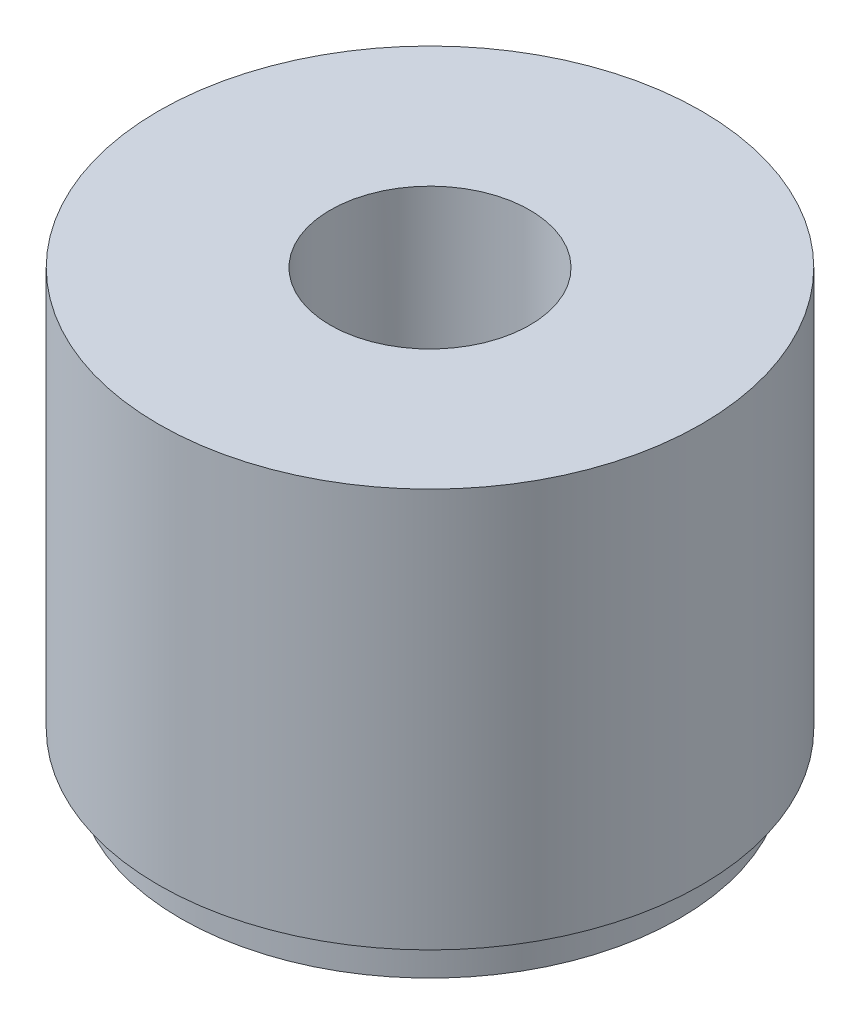
ISO-10303-21;
HEADER;
FILE_DESCRIPTION(('STEP AP214'),'2;1');
FILE_NAME('part.step','',(''),(''),'','','');
FILE_SCHEMA(('AUTOMOTIVE_DESIGN { 1 0 10303 214 1 1 1 1 }'));
ENDSEC;
DATA;
#1=APPLICATION_CONTEXT('core data for automotive mechanical design processes');
#2=APPLICATION_PROTOCOL_DEFINITION('international standard','automotive_design',2000,#1);
#3=PRODUCT_CONTEXT('',#1,'mechanical');
#4=PRODUCT('Part','Part','',(#3));
#5=PRODUCT_RELATED_PRODUCT_CATEGORY('part','',(#4));
#6=PRODUCT_DEFINITION_FORMATION('','',#4);
#7=PRODUCT_DEFINITION_CONTEXT('part definition',#1,'design');
#8=PRODUCT_DEFINITION('design','',#6,#7);
#9=PRODUCT_DEFINITION_SHAPE('','',#8);
#10=(LENGTH_UNIT() NAMED_UNIT(*) SI_UNIT(.MILLI.,.METRE.));
#11=(NAMED_UNIT(*) PLANE_ANGLE_UNIT() SI_UNIT($,.RADIAN.));
#12=(NAMED_UNIT(*) SI_UNIT($,.STERADIAN.) SOLID_ANGLE_UNIT());
#13=UNCERTAINTY_MEASURE_WITH_UNIT(LENGTH_MEASURE(1.E-05),#10,'distance_accuracy_value','');
#14=(GEOMETRIC_REPRESENTATION_CONTEXT(3) GLOBAL_UNCERTAINTY_ASSIGNED_CONTEXT((#13)) GLOBAL_UNIT_ASSIGNED_CONTEXT((#10,
#11,#12)) REPRESENTATION_CONTEXT('',''));
#15=CARTESIAN_POINT('',(0.,0.,0.));
#16=DIRECTION('',(0.,0.,1.));
#17=DIRECTION('',(1.,0.,0.));
#18=AXIS2_PLACEMENT_3D('',#15,#16,#17);
#19=CARTESIAN_POINT('',(-0.920226726634612,-1.53162301344233,0.211554026912954));
#20=DIRECTION('',(0.,-1.,0.));
#21=DIRECTION('',(0.,0.,-1.));
#22=AXIS2_PLACEMENT_3D('',#19,#20,#21);
#23=PLANE('',#22);
#24=CARTESIAN_POINT('',(-0.920226726634612,-1.53162301344233,0.211554026912954));
#25=DIRECTION('',(0.,-1.,0.));
#26=DIRECTION('',(0.,0.,-1.));
#27=AXIS2_PLACEMENT_3D('',#24,#25,#26);
#28=CIRCLE('',#27,6.25);
#29=CARTESIAN_POINT('',(-0.920226726634612,-1.53162301344233,-6.03844597308705));
#30=VERTEX_POINT('',#29);
#31=EDGE_CURVE('E10',#30,#30,#28,.T.);
#32=ORIENTED_EDGE('',*,*,#31,.T.);
#33=EDGE_LOOP('',(#32));
#34=FACE_BOUND('',#33,.T.);
#35=CARTESIAN_POINT('',(-0.920226726634612,-1.53162301344233,0.211554026912954));
#36=DIRECTION('',(0.,-1.,0.));
#37=DIRECTION('',(0.,0.,-1.));
#38=AXIS2_PLACEMENT_3D('',#35,#36,#37);
#39=CIRCLE('',#38,2.5);
#40=CARTESIAN_POINT('',(-0.920226726634612,-1.53162301344233,-2.28844597308705));
#41=VERTEX_POINT('',#40);
#42=EDGE_CURVE('E43',#41,#41,#39,.T.);
#43=ORIENTED_EDGE('',*,*,#42,.F.);
#44=EDGE_LOOP('',(#43));
#45=FACE_BOUND('',#44,.T.);
#46=ADVANCED_FACE('F35',(#34,#45),#23,.T.);
#47=CARTESIAN_POINT('',(-0.920226726634612,-1.53162301344233,0.211554026912954));
#48=DIRECTION('',(0.,1.,0.));
#49=DIRECTION('',(0.,0.,1.));
#50=AXIS2_PLACEMENT_3D('',#47,#48,#49);
#51=CYLINDRICAL_SURFACE('',#50,6.25);
#52=ORIENTED_EDGE('',*,*,#31,.F.);
#53=EDGE_LOOP('',(#52));
#54=FACE_BOUND('',#53,.T.);
#55=CARTESIAN_POINT('',(-0.920226726634612,-0.531623013442332,0.211554026912954));
#56=DIRECTION('',(0.,-1.,0.));
#57=DIRECTION('',(0.,0.,-1.));
#58=AXIS2_PLACEMENT_3D('',#55,#56,#57);
#59=CIRCLE('',#58,6.25);
#60=CARTESIAN_POINT('',(-0.920226726634612,-0.531623013442332,-6.03844597308705));
#61=VERTEX_POINT('',#60);
#62=EDGE_CURVE('E39',#61,#61,#59,.T.);
#63=ORIENTED_EDGE('',*,*,#62,.T.);
#64=EDGE_LOOP('',(#63));
#65=FACE_BOUND('',#64,.T.);
#66=ADVANCED_FACE('F37',(#54,#65),#51,.T.);
#67=CARTESIAN_POINT('',(-0.920226726634612,-1.53162301344233,0.211554026912954));
#68=DIRECTION('',(0.,1.,0.));
#69=DIRECTION('',(0.,0.,1.));
#70=AXIS2_PLACEMENT_3D('',#67,#68,#69);
#71=CYLINDRICAL_SURFACE('',#70,2.5);
#72=ORIENTED_EDGE('',*,*,#42,.T.);
#73=EDGE_LOOP('',(#72));
#74=FACE_BOUND('',#73,.T.);
#75=CARTESIAN_POINT('',(-0.920226726634612,9.46837698655767,0.211554026912954));
#76=DIRECTION('',(0.,1.,0.));
#77=DIRECTION('',(0.,0.,1.));
#78=AXIS2_PLACEMENT_3D('',#75,#76,#77);
#79=CIRCLE('',#78,2.5);
#80=CARTESIAN_POINT('',(-0.920226726634612,9.46837698655767,2.71155402691296));
#81=VERTEX_POINT('',#80);
#82=EDGE_CURVE('E53',#81,#81,#79,.T.);
#83=ORIENTED_EDGE('',*,*,#82,.T.);
#84=EDGE_LOOP('',(#83));
#85=FACE_BOUND('',#84,.T.);
#86=ADVANCED_FACE('F59',(#74,#85),#71,.F.);
#87=CARTESIAN_POINT('',(-0.920226726634612,9.46837698655767,0.211554026912954));
#88=DIRECTION('',(0.,1.,0.));
#89=DIRECTION('',(0.,0.,1.));
#90=AXIS2_PLACEMENT_3D('',#87,#88,#89);
#91=PLANE('',#90);
#92=CARTESIAN_POINT('',(-0.920226726634612,9.46837698655767,0.211554026912954));
#93=DIRECTION('',(0.,1.,0.));
#94=DIRECTION('',(0.,0.,1.));
#95=AXIS2_PLACEMENT_3D('',#92,#93,#94);
#96=CIRCLE('',#95,6.8);
#97=CARTESIAN_POINT('',(-0.920226726634612,9.46837698655767,7.01155402691295));
#98=VERTEX_POINT('',#97);
#99=EDGE_CURVE('E52',#98,#98,#96,.T.);
#100=ORIENTED_EDGE('',*,*,#99,.T.);
#101=EDGE_LOOP('',(#100));
#102=FACE_BOUND('',#101,.T.);
#103=ORIENTED_EDGE('',*,*,#82,.F.);
#104=EDGE_LOOP('',(#103));
#105=FACE_BOUND('',#104,.T.);
#106=ADVANCED_FACE('F61',(#102,#105),#91,.T.);
#107=CARTESIAN_POINT('',(-0.920226726634612,-0.531623013442332,0.211554026912954));
#108=DIRECTION('',(0.,1.,0.));
#109=DIRECTION('',(0.,0.,1.));
#110=AXIS2_PLACEMENT_3D('',#107,#108,#109);
#111=PLANE('',#110);
#112=ORIENTED_EDGE('',*,*,#62,.F.);
#113=EDGE_LOOP('',(#112));
#114=FACE_BOUND('',#113,.T.);
#115=CARTESIAN_POINT('',(-0.920226726634612,-0.531623013442332,0.211554026912954));
#116=DIRECTION('',(0.,1.,0.));
#117=DIRECTION('',(0.,0.,1.));
#118=AXIS2_PLACEMENT_3D('',#115,#116,#117);
#119=CIRCLE('',#118,6.8);
#120=CARTESIAN_POINT('',(-0.920226726634612,-0.531623013442332,7.01155402691295));
#121=VERTEX_POINT('',#120);
#122=EDGE_CURVE('E49',#121,#121,#119,.T.);
#123=ORIENTED_EDGE('',*,*,#122,.F.);
#124=EDGE_LOOP('',(#123));
#125=FACE_BOUND('',#124,.T.);
#126=ADVANCED_FACE('F63',(#114,#125),#111,.F.);
#127=CARTESIAN_POINT('',(-0.920226726634612,9.46837698655767,0.211554026912954));
#128=DIRECTION('',(0.,-1.,0.));
#129=DIRECTION('',(0.,0.,-1.));
#130=AXIS2_PLACEMENT_3D('',#127,#128,#129);
#131=CYLINDRICAL_SURFACE('',#130,6.8);
#132=ORIENTED_EDGE('',*,*,#99,.F.);
#133=EDGE_LOOP('',(#132));
#134=FACE_BOUND('',#133,.T.);
#135=ORIENTED_EDGE('',*,*,#122,.T.);
#136=EDGE_LOOP('',(#135));
#137=FACE_BOUND('',#136,.T.);
#138=ADVANCED_FACE('F70',(#134,#137),#131,.T.);
#139=CLOSED_SHELL('',(#46,#66,#86,#106,#126,#138));
#140=MANIFOLD_SOLID_BREP('B2',#139);
#141=ADVANCED_BREP_SHAPE_REPRESENTATION('',(#18,#140),#14);
#142=SHAPE_DEFINITION_REPRESENTATION(#9,#141);
ENDSEC;
END-ISO-10303-21;
